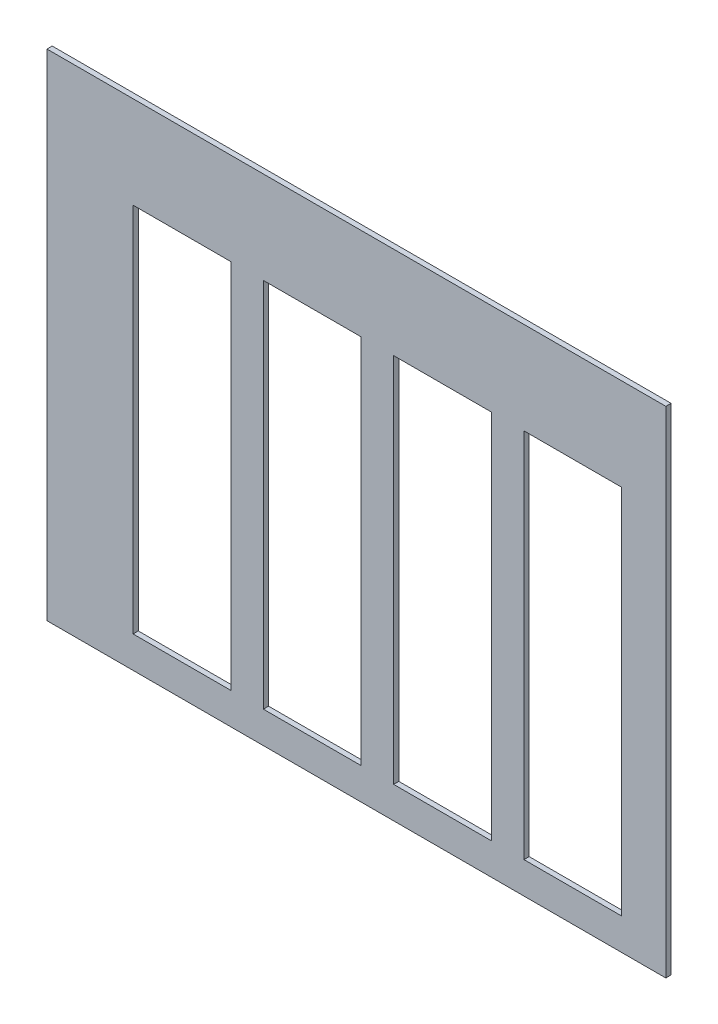
ISO-10303-21;
HEADER;
FILE_DESCRIPTION(('STEP AP214'),'2;1');
FILE_NAME('part.step','',(''),(''),'','','');
FILE_SCHEMA(('AUTOMOTIVE_DESIGN { 1 0 10303 214 1 1 1 1 }'));
ENDSEC;
DATA;
#1=APPLICATION_CONTEXT('core data for automotive mechanical design processes');
#2=APPLICATION_PROTOCOL_DEFINITION('international standard','automotive_design',2000,#1);
#3=PRODUCT_CONTEXT('',#1,'mechanical');
#4=PRODUCT('Part','Part','',(#3));
#5=PRODUCT_RELATED_PRODUCT_CATEGORY('part','',(#4));
#6=PRODUCT_DEFINITION_FORMATION('','',#4);
#7=PRODUCT_DEFINITION_CONTEXT('part definition',#1,'design');
#8=PRODUCT_DEFINITION('design','',#6,#7);
#9=PRODUCT_DEFINITION_SHAPE('','',#8);
#10=(LENGTH_UNIT() NAMED_UNIT(*) SI_UNIT(.MILLI.,.METRE.));
#11=(NAMED_UNIT(*) PLANE_ANGLE_UNIT() SI_UNIT($,.RADIAN.));
#12=(NAMED_UNIT(*) SI_UNIT($,.STERADIAN.) SOLID_ANGLE_UNIT());
#13=UNCERTAINTY_MEASURE_WITH_UNIT(LENGTH_MEASURE(1.E-05),#10,'distance_accuracy_value','');
#14=(GEOMETRIC_REPRESENTATION_CONTEXT(3) GLOBAL_UNCERTAINTY_ASSIGNED_CONTEXT((#13)) GLOBAL_UNIT_ASSIGNED_CONTEXT((#10,
#11,#12)) REPRESENTATION_CONTEXT('',''));
#15=CARTESIAN_POINT('',(0.,0.,0.));
#16=DIRECTION('',(0.,0.,1.));
#17=DIRECTION('',(1.,0.,0.));
#18=AXIS2_PLACEMENT_3D('',#15,#16,#17);
#19=CARTESIAN_POINT('',(0.,0.,8.));
#20=DIRECTION('',(0.,0.,1.));
#21=DIRECTION('',(1.,0.,0.));
#22=AXIS2_PLACEMENT_3D('',#19,#20,#21);
#23=PLANE('',#22);
#24=DIRECTION('',(0.,-1.,0.));
#25=VECTOR('',#24,1.);
#26=CARTESIAN_POINT('',(-725.,218.222891566265,8.));
#27=LINE('',#26,#25);
#28=CARTESIAN_POINT('',(-725.,218.222891566265,8.));
#29=VERTEX_POINT('',#28);
#30=CARTESIAN_POINT('',(-725.,-541.777108433735,8.));
#31=VERTEX_POINT('',#30);
#32=EDGE_CURVE('E307',#29,#31,#27,.T.);
#33=ORIENTED_EDGE('',*,*,#32,.T.);
#34=DIRECTION('',(1.,0.,0.));
#35=VECTOR('',#34,1.);
#36=CARTESIAN_POINT('',(-725.,-541.777108433735,8.));
#37=LINE('',#36,#35);
#38=CARTESIAN_POINT('',(225.,-541.777108433735,8.));
#39=VERTEX_POINT('',#38);
#40=EDGE_CURVE('E310',#31,#39,#37,.T.);
#41=ORIENTED_EDGE('',*,*,#40,.T.);
#42=DIRECTION('',(0.,1.,0.));
#43=VECTOR('',#42,1.);
#44=CARTESIAN_POINT('',(225.,218.222891566265,8.));
#45=LINE('',#44,#43);
#46=CARTESIAN_POINT('',(225.,218.222891566265,8.));
#47=VERTEX_POINT('',#46);
#48=EDGE_CURVE('E313',#39,#47,#45,.T.);
#49=ORIENTED_EDGE('',*,*,#48,.T.);
#50=DIRECTION('',(-1.,0.,0.));
#51=VECTOR('',#50,1.);
#52=CARTESIAN_POINT('',(-725.,218.222891566265,8.));
#53=LINE('',#52,#51);
#54=EDGE_CURVE('E315',#47,#29,#53,.T.);
#55=ORIENTED_EDGE('',*,*,#54,.T.);
#56=EDGE_LOOP('',(#33,#41,#49,#55));
#57=FACE_BOUND('',#56,.T.);
#58=DIRECTION('',(1.,0.,0.));
#59=VECTOR('',#58,1.);
#60=CARTESIAN_POINT('',(-592.817445786005,-493.283894145643,8.));
#61=LINE('',#60,#59);
#62=CARTESIAN_POINT('',(-592.817445786005,-493.283894145643,8.));
#63=VERTEX_POINT('',#62);
#64=CARTESIAN_POINT('',(-442.817445786005,-493.283894145643,8.));
#65=VERTEX_POINT('',#64);
#66=EDGE_CURVE('E278',#63,#65,#61,.T.);
#67=ORIENTED_EDGE('',*,*,#66,.F.);
#68=DIRECTION('',(0.,-1.,0.));
#69=VECTOR('',#68,1.);
#70=CARTESIAN_POINT('',(-592.817445786005,76.7161058543569,8.));
#71=LINE('',#70,#69);
#72=CARTESIAN_POINT('',(-592.817445786005,76.7161058543569,8.));
#73=VERTEX_POINT('',#72);
#74=EDGE_CURVE('E276',#73,#63,#71,.T.);
#75=ORIENTED_EDGE('',*,*,#74,.F.);
#76=DIRECTION('',(-1.,0.,0.));
#77=VECTOR('',#76,1.);
#78=CARTESIAN_POINT('',(-592.817445786005,76.7161058543569,8.));
#79=LINE('',#78,#77);
#80=CARTESIAN_POINT('',(-442.817445786005,76.7161058543569,8.));
#81=VERTEX_POINT('',#80);
#82=EDGE_CURVE('E284',#81,#73,#79,.T.);
#83=ORIENTED_EDGE('',*,*,#82,.F.);
#84=DIRECTION('',(0.,1.,0.));
#85=VECTOR('',#84,1.);
#86=CARTESIAN_POINT('',(-442.817445786005,76.7161058543569,8.));
#87=LINE('',#86,#85);
#88=EDGE_CURVE('E281',#65,#81,#87,.T.);
#89=ORIENTED_EDGE('',*,*,#88,.F.);
#90=EDGE_LOOP('',(#67,#75,#83,#89));
#91=FACE_BOUND('',#90,.T.);
#92=DIRECTION('',(0.,-1.,0.));
#93=VECTOR('',#92,1.);
#94=CARTESIAN_POINT('',(-392.817445786005,76.7161058543569,8.));
#95=LINE('',#94,#93);
#96=CARTESIAN_POINT('',(-392.817445786005,76.7161058543569,8.));
#97=VERTEX_POINT('',#96);
#98=CARTESIAN_POINT('',(-392.817445786005,-493.283894145643,8.));
#99=VERTEX_POINT('',#98);
#100=EDGE_CURVE('E247',#97,#99,#95,.T.);
#101=ORIENTED_EDGE('',*,*,#100,.F.);
#102=DIRECTION('',(-1.,0.,0.));
#103=VECTOR('',#102,1.);
#104=CARTESIAN_POINT('',(-392.817445786005,76.7161058543569,8.));
#105=LINE('',#104,#103);
#106=CARTESIAN_POINT('',(-242.817445786005,76.7161058543569,8.));
#107=VERTEX_POINT('',#106);
#108=EDGE_CURVE('E245',#107,#97,#105,.T.);
#109=ORIENTED_EDGE('',*,*,#108,.F.);
#110=DIRECTION('',(0.,1.,0.));
#111=VECTOR('',#110,1.);
#112=CARTESIAN_POINT('',(-242.817445786005,76.7161058543569,8.));
#113=LINE('',#112,#111);
#114=CARTESIAN_POINT('',(-242.817445786005,-493.283894145643,8.));
#115=VERTEX_POINT('',#114);
#116=EDGE_CURVE('E253',#115,#107,#113,.T.);
#117=ORIENTED_EDGE('',*,*,#116,.F.);
#118=DIRECTION('',(1.,0.,0.));
#119=VECTOR('',#118,1.);
#120=CARTESIAN_POINT('',(-392.817445786005,-493.283894145643,8.));
#121=LINE('',#120,#119);
#122=EDGE_CURVE('E250',#99,#115,#121,.T.);
#123=ORIENTED_EDGE('',*,*,#122,.F.);
#124=EDGE_LOOP('',(#101,#109,#117,#123));
#125=FACE_BOUND('',#124,.T.);
#126=DIRECTION('',(0.,-1.,0.));
#127=VECTOR('',#126,1.);
#128=CARTESIAN_POINT('',(-192.817445786005,76.7161058543569,8.));
#129=LINE('',#128,#127);
#130=CARTESIAN_POINT('',(-192.817445786005,76.7161058543569,8.));
#131=VERTEX_POINT('',#130);
#132=CARTESIAN_POINT('',(-192.817445786005,-493.283894145643,8.));
#133=VERTEX_POINT('',#132);
#134=EDGE_CURVE('E216',#131,#133,#129,.T.);
#135=ORIENTED_EDGE('',*,*,#134,.F.);
#136=DIRECTION('',(-1.,0.,0.));
#137=VECTOR('',#136,1.);
#138=CARTESIAN_POINT('',(-192.817445786005,76.7161058543569,8.));
#139=LINE('',#138,#137);
#140=CARTESIAN_POINT('',(-42.8174457860048,76.7161058543569,8.));
#141=VERTEX_POINT('',#140);
#142=EDGE_CURVE('E214',#141,#131,#139,.T.);
#143=ORIENTED_EDGE('',*,*,#142,.F.);
#144=DIRECTION('',(0.,1.,0.));
#145=VECTOR('',#144,1.);
#146=CARTESIAN_POINT('',(-42.8174457860048,76.7161058543569,8.));
#147=LINE('',#146,#145);
#148=CARTESIAN_POINT('',(-42.8174457860047,-493.283894145643,8.));
#149=VERTEX_POINT('',#148);
#150=EDGE_CURVE('E222',#149,#141,#147,.T.);
#151=ORIENTED_EDGE('',*,*,#150,.F.);
#152=DIRECTION('',(1.,0.,0.));
#153=VECTOR('',#152,1.);
#154=CARTESIAN_POINT('',(-192.817445786005,-493.283894145643,8.));
#155=LINE('',#154,#153);
#156=EDGE_CURVE('E219',#133,#149,#155,.T.);
#157=ORIENTED_EDGE('',*,*,#156,.F.);
#158=EDGE_LOOP('',(#135,#143,#151,#157));
#159=FACE_BOUND('',#158,.T.);
#160=DIRECTION('',(0.,-1.,0.));
#161=VECTOR('',#160,1.);
#162=CARTESIAN_POINT('',(7.18255421399527,76.7161058543569,8.));
#163=LINE('',#162,#161);
#164=CARTESIAN_POINT('',(7.18255421399527,76.7161058543569,8.));
#165=VERTEX_POINT('',#164);
#166=CARTESIAN_POINT('',(7.18255421399538,-493.283894145643,8.));
#167=VERTEX_POINT('',#166);
#168=EDGE_CURVE('E186',#165,#167,#163,.T.);
#169=ORIENTED_EDGE('',*,*,#168,.F.);
#170=DIRECTION('',(-1.,0.,0.));
#171=VECTOR('',#170,1.);
#172=CARTESIAN_POINT('',(7.18255421399527,76.7161058543569,8.));
#173=LINE('',#172,#171);
#174=CARTESIAN_POINT('',(157.182554213995,76.7161058543569,8.));
#175=VERTEX_POINT('',#174);
#176=EDGE_CURVE('E178',#175,#165,#173,.T.);
#177=ORIENTED_EDGE('',*,*,#176,.F.);
#178=DIRECTION('',(0.,1.,0.));
#179=VECTOR('',#178,1.);
#180=CARTESIAN_POINT('',(157.182554213995,76.7161058543569,8.));
#181=LINE('',#180,#179);
#182=CARTESIAN_POINT('',(157.182554213995,-493.283894145643,8.));
#183=VERTEX_POINT('',#182);
#184=EDGE_CURVE('E200',#183,#175,#181,.T.);
#185=ORIENTED_EDGE('',*,*,#184,.F.);
#186=DIRECTION('',(1.,0.,0.));
#187=VECTOR('',#186,1.);
#188=CARTESIAN_POINT('',(7.18255421399538,-493.283894145643,8.));
#189=LINE('',#188,#187);
#190=EDGE_CURVE('E198',#167,#183,#189,.T.);
#191=ORIENTED_EDGE('',*,*,#190,.F.);
#192=EDGE_LOOP('',(#169,#177,#185,#191));
#193=FACE_BOUND('',#192,.T.);
#194=ADVANCED_FACE('F41',(#57,#91,#125,#159,#193),#23,.T.);
#195=CARTESIAN_POINT('',(0.,0.,0.));
#196=DIRECTION('',(0.,0.,1.));
#197=DIRECTION('',(1.,0.,0.));
#198=AXIS2_PLACEMENT_3D('',#195,#196,#197);
#199=PLANE('',#198);
#200=DIRECTION('',(-1.,0.,0.));
#201=VECTOR('',#200,1.);
#202=CARTESIAN_POINT('',(-192.817445786005,76.7161058543569,0.));
#203=LINE('',#202,#201);
#204=CARTESIAN_POINT('',(-42.8174457860048,76.7161058543569,0.));
#205=VERTEX_POINT('',#204);
#206=CARTESIAN_POINT('',(-192.817445786005,76.7161058543569,0.));
#207=VERTEX_POINT('',#206);
#208=EDGE_CURVE('E194',#205,#207,#203,.T.);
#209=ORIENTED_EDGE('',*,*,#208,.T.);
#210=DIRECTION('',(0.,-1.,0.));
#211=VECTOR('',#210,1.);
#212=CARTESIAN_POINT('',(-192.817445786005,76.7161058543569,0.));
#213=LINE('',#212,#211);
#214=CARTESIAN_POINT('',(-192.817445786005,-493.283894145643,0.));
#215=VERTEX_POINT('',#214);
#216=EDGE_CURVE('E227',#207,#215,#213,.T.);
#217=ORIENTED_EDGE('',*,*,#216,.T.);
#218=DIRECTION('',(1.,0.,0.));
#219=VECTOR('',#218,1.);
#220=CARTESIAN_POINT('',(-192.817445786005,-493.283894145643,0.));
#221=LINE('',#220,#219);
#222=CARTESIAN_POINT('',(-42.8174457860047,-493.283894145643,0.));
#223=VERTEX_POINT('',#222);
#224=EDGE_CURVE('E230',#215,#223,#221,.T.);
#225=ORIENTED_EDGE('',*,*,#224,.T.);
#226=DIRECTION('',(0.,1.,0.));
#227=VECTOR('',#226,1.);
#228=CARTESIAN_POINT('',(-42.8174457860048,76.7161058543569,0.));
#229=LINE('',#228,#227);
#230=EDGE_CURVE('E217',#223,#205,#229,.T.);
#231=ORIENTED_EDGE('',*,*,#230,.T.);
#232=EDGE_LOOP('',(#209,#217,#225,#231));
#233=FACE_BOUND('',#232,.T.);
#234=DIRECTION('',(0.,-1.,0.));
#235=VECTOR('',#234,1.);
#236=CARTESIAN_POINT('',(-592.817445786005,76.7161058543569,0.));
#237=LINE('',#236,#235);
#238=CARTESIAN_POINT('',(-592.817445786005,76.7161058543569,0.));
#239=VERTEX_POINT('',#238);
#240=CARTESIAN_POINT('',(-592.817445786005,-493.283894145643,0.));
#241=VERTEX_POINT('',#240);
#242=EDGE_CURVE('E275',#239,#241,#237,.T.);
#243=ORIENTED_EDGE('',*,*,#242,.T.);
#244=DIRECTION('',(1.,0.,0.));
#245=VECTOR('',#244,1.);
#246=CARTESIAN_POINT('',(-592.817445786005,-493.283894145643,0.));
#247=LINE('',#246,#245);
#248=CARTESIAN_POINT('',(-442.817445786005,-493.283894145643,0.));
#249=VERTEX_POINT('',#248);
#250=EDGE_CURVE('E289',#241,#249,#247,.T.);
#251=ORIENTED_EDGE('',*,*,#250,.T.);
#252=DIRECTION('',(0.,1.,0.));
#253=VECTOR('',#252,1.);
#254=CARTESIAN_POINT('',(-442.817445786005,76.7161058543569,0.));
#255=LINE('',#254,#253);
#256=CARTESIAN_POINT('',(-442.817445786005,76.7161058543569,0.));
#257=VERTEX_POINT('',#256);
#258=EDGE_CURVE('E292',#249,#257,#255,.T.);
#259=ORIENTED_EDGE('',*,*,#258,.T.);
#260=DIRECTION('',(-1.,0.,0.));
#261=VECTOR('',#260,1.);
#262=CARTESIAN_POINT('',(-592.817445786005,76.7161058543569,0.));
#263=LINE('',#262,#261);
#264=EDGE_CURVE('E279',#257,#239,#263,.T.);
#265=ORIENTED_EDGE('',*,*,#264,.T.);
#266=EDGE_LOOP('',(#243,#251,#259,#265));
#267=FACE_BOUND('',#266,.T.);
#268=DIRECTION('',(0.,-1.,0.));
#269=VECTOR('',#268,1.);
#270=CARTESIAN_POINT('',(-725.,218.222891566265,0.));
#271=LINE('',#270,#269);
#272=CARTESIAN_POINT('',(-725.,218.222891566265,0.));
#273=VERTEX_POINT('',#272);
#274=CARTESIAN_POINT('',(-725.,-541.777108433735,0.));
#275=VERTEX_POINT('',#274);
#276=EDGE_CURVE('E306',#273,#275,#271,.T.);
#277=ORIENTED_EDGE('',*,*,#276,.F.);
#278=DIRECTION('',(-1.,0.,0.));
#279=VECTOR('',#278,1.);
#280=CARTESIAN_POINT('',(-725.,218.222891566265,0.));
#281=LINE('',#280,#279);
#282=CARTESIAN_POINT('',(225.,218.222891566265,0.));
#283=VERTEX_POINT('',#282);
#284=EDGE_CURVE('E311',#283,#273,#281,.T.);
#285=ORIENTED_EDGE('',*,*,#284,.F.);
#286=DIRECTION('',(0.,1.,0.));
#287=VECTOR('',#286,1.);
#288=CARTESIAN_POINT('',(225.,218.222891566265,0.));
#289=LINE('',#288,#287);
#290=CARTESIAN_POINT('',(225.,-541.777108433735,0.));
#291=VERTEX_POINT('',#290);
#292=EDGE_CURVE('E322',#291,#283,#289,.T.);
#293=ORIENTED_EDGE('',*,*,#292,.F.);
#294=DIRECTION('',(1.,0.,0.));
#295=VECTOR('',#294,1.);
#296=CARTESIAN_POINT('',(-725.,-541.777108433735,0.));
#297=LINE('',#296,#295);
#298=EDGE_CURVE('E320',#275,#291,#297,.T.);
#299=ORIENTED_EDGE('',*,*,#298,.F.);
#300=EDGE_LOOP('',(#277,#285,#293,#299));
#301=FACE_BOUND('',#300,.T.);
#302=DIRECTION('',(-1.,0.,0.));
#303=VECTOR('',#302,1.);
#304=CARTESIAN_POINT('',(-392.817445786005,76.7161058543569,0.));
#305=LINE('',#304,#303);
#306=CARTESIAN_POINT('',(-242.817445786005,76.7161058543569,0.));
#307=VERTEX_POINT('',#306);
#308=CARTESIAN_POINT('',(-392.817445786005,76.7161058543569,0.));
#309=VERTEX_POINT('',#308);
#310=EDGE_CURVE('E244',#307,#309,#305,.T.);
#311=ORIENTED_EDGE('',*,*,#310,.T.);
#312=DIRECTION('',(0.,-1.,0.));
#313=VECTOR('',#312,1.);
#314=CARTESIAN_POINT('',(-392.817445786005,76.7161058543569,0.));
#315=LINE('',#314,#313);
#316=CARTESIAN_POINT('',(-392.817445786005,-493.283894145643,0.));
#317=VERTEX_POINT('',#316);
#318=EDGE_CURVE('E258',#309,#317,#315,.T.);
#319=ORIENTED_EDGE('',*,*,#318,.T.);
#320=DIRECTION('',(1.,0.,0.));
#321=VECTOR('',#320,1.);
#322=CARTESIAN_POINT('',(-392.817445786005,-493.283894145643,0.));
#323=LINE('',#322,#321);
#324=CARTESIAN_POINT('',(-242.817445786005,-493.283894145643,0.));
#325=VERTEX_POINT('',#324);
#326=EDGE_CURVE('E261',#317,#325,#323,.T.);
#327=ORIENTED_EDGE('',*,*,#326,.T.);
#328=DIRECTION('',(0.,1.,0.));
#329=VECTOR('',#328,1.);
#330=CARTESIAN_POINT('',(-242.817445786005,76.7161058543569,0.));
#331=LINE('',#330,#329);
#332=EDGE_CURVE('E248',#325,#307,#331,.T.);
#333=ORIENTED_EDGE('',*,*,#332,.T.);
#334=EDGE_LOOP('',(#311,#319,#327,#333));
#335=FACE_BOUND('',#334,.T.);
#336=DIRECTION('',(-1.,0.,0.));
#337=VECTOR('',#336,1.);
#338=CARTESIAN_POINT('',(7.18255421399527,76.7161058543569,0.));
#339=LINE('',#338,#337);
#340=CARTESIAN_POINT('',(157.182554213995,76.7161058543569,0.));
#341=VERTEX_POINT('',#340);
#342=CARTESIAN_POINT('',(7.18255421399527,76.7161058543569,0.));
#343=VERTEX_POINT('',#342);
#344=EDGE_CURVE('E64',#341,#343,#339,.T.);
#345=ORIENTED_EDGE('',*,*,#344,.T.);
#346=DIRECTION('',(0.,-1.,0.));
#347=VECTOR('',#346,1.);
#348=CARTESIAN_POINT('',(7.18255421399527,76.7161058543569,0.));
#349=LINE('',#348,#347);
#350=CARTESIAN_POINT('',(7.18255421399538,-493.283894145643,0.));
#351=VERTEX_POINT('',#350);
#352=EDGE_CURVE('E193',#343,#351,#349,.T.);
#353=ORIENTED_EDGE('',*,*,#352,.T.);
#354=DIRECTION('',(1.,0.,0.));
#355=VECTOR('',#354,1.);
#356=CARTESIAN_POINT('',(7.18255421399538,-493.283894145643,0.));
#357=LINE('',#356,#355);
#358=CARTESIAN_POINT('',(157.182554213995,-493.283894145643,0.));
#359=VERTEX_POINT('',#358);
#360=EDGE_CURVE('E206',#351,#359,#357,.T.);
#361=ORIENTED_EDGE('',*,*,#360,.T.);
#362=DIRECTION('',(0.,1.,0.));
#363=VECTOR('',#362,1.);
#364=CARTESIAN_POINT('',(157.182554213995,76.7161058543569,0.));
#365=LINE('',#364,#363);
#366=EDGE_CURVE('E187',#359,#341,#365,.T.);
#367=ORIENTED_EDGE('',*,*,#366,.T.);
#368=EDGE_LOOP('',(#345,#353,#361,#367));
#369=FACE_BOUND('',#368,.T.);
#370=ADVANCED_FACE('F340',(#233,#267,#301,#335,#369),#199,.F.);
#371=CARTESIAN_POINT('',(-725.,218.222891566265,8.));
#372=DIRECTION('',(1.,0.,0.));
#373=DIRECTION('',(0.,1.,0.));
#374=AXIS2_PLACEMENT_3D('',#371,#372,#373);
#375=PLANE('',#374);
#376=ORIENTED_EDGE('',*,*,#276,.T.);
#377=DIRECTION('',(0.,0.,-1.));
#378=VECTOR('',#377,1.);
#379=CARTESIAN_POINT('',(-725.,-541.777108433735,8.));
#380=LINE('',#379,#378);
#381=EDGE_CURVE('E11',#31,#275,#380,.T.);
#382=ORIENTED_EDGE('',*,*,#381,.F.);
#383=ORIENTED_EDGE('',*,*,#32,.F.);
#384=DIRECTION('',(0.,0.,-1.));
#385=VECTOR('',#384,1.);
#386=CARTESIAN_POINT('',(-725.,218.222891566265,8.));
#387=LINE('',#386,#385);
#388=EDGE_CURVE('E317',#29,#273,#387,.T.);
#389=ORIENTED_EDGE('',*,*,#388,.T.);
#390=EDGE_LOOP('',(#376,#382,#383,#389));
#391=FACE_BOUND('',#390,.T.);
#392=ADVANCED_FACE('F43',(#391),#375,.F.);
#393=CARTESIAN_POINT('',(-725.,-541.777108433735,8.));
#394=DIRECTION('',(0.,1.,0.));
#395=DIRECTION('',(0.,0.,1.));
#396=AXIS2_PLACEMENT_3D('',#393,#394,#395);
#397=PLANE('',#396);
#398=ORIENTED_EDGE('',*,*,#298,.T.);
#399=DIRECTION('',(0.,0.,-1.));
#400=VECTOR('',#399,1.);
#401=CARTESIAN_POINT('',(225.,-541.777108433735,8.));
#402=LINE('',#401,#400);
#403=EDGE_CURVE('E49',#39,#291,#402,.T.);
#404=ORIENTED_EDGE('',*,*,#403,.F.);
#405=ORIENTED_EDGE('',*,*,#40,.F.);
#406=ORIENTED_EDGE('',*,*,#381,.T.);
#407=EDGE_LOOP('',(#398,#404,#405,#406));
#408=FACE_BOUND('',#407,.T.);
#409=ADVANCED_FACE('F351',(#408),#397,.F.);
#410=CARTESIAN_POINT('',(225.,218.222891566265,8.));
#411=DIRECTION('',(-1.,0.,0.));
#412=DIRECTION('',(0.,-1.,0.));
#413=AXIS2_PLACEMENT_3D('',#410,#411,#412);
#414=PLANE('',#413);
#415=ORIENTED_EDGE('',*,*,#292,.T.);
#416=DIRECTION('',(0.,0.,-1.));
#417=VECTOR('',#416,1.);
#418=CARTESIAN_POINT('',(225.,218.222891566265,8.));
#419=LINE('',#418,#417);
#420=EDGE_CURVE('E327',#47,#283,#419,.T.);
#421=ORIENTED_EDGE('',*,*,#420,.F.);
#422=ORIENTED_EDGE('',*,*,#48,.F.);
#423=ORIENTED_EDGE('',*,*,#403,.T.);
#424=EDGE_LOOP('',(#415,#421,#422,#423));
#425=FACE_BOUND('',#424,.T.);
#426=ADVANCED_FACE('F334',(#425),#414,.F.);
#427=CARTESIAN_POINT('',(-725.,218.222891566265,8.));
#428=DIRECTION('',(0.,-1.,0.));
#429=DIRECTION('',(1.,0.,0.));
#430=AXIS2_PLACEMENT_3D('',#427,#428,#429);
#431=PLANE('',#430);
#432=ORIENTED_EDGE('',*,*,#284,.T.);
#433=ORIENTED_EDGE('',*,*,#388,.F.);
#434=ORIENTED_EDGE('',*,*,#54,.F.);
#435=ORIENTED_EDGE('',*,*,#420,.T.);
#436=EDGE_LOOP('',(#432,#433,#434,#435));
#437=FACE_BOUND('',#436,.T.);
#438=ADVANCED_FACE('F344',(#437),#431,.F.);
#439=CARTESIAN_POINT('',(-592.817445786005,76.7161058543569,8.));
#440=DIRECTION('',(1.,0.,0.));
#441=DIRECTION('',(0.,1.,0.));
#442=AXIS2_PLACEMENT_3D('',#439,#440,#441);
#443=PLANE('',#442);
#444=ORIENTED_EDGE('',*,*,#242,.F.);
#445=DIRECTION('',(0.,0.,-1.));
#446=VECTOR('',#445,1.);
#447=CARTESIAN_POINT('',(-592.817445786005,76.7161058543569,8.));
#448=LINE('',#447,#446);
#449=EDGE_CURVE('E286',#73,#239,#448,.T.);
#450=ORIENTED_EDGE('',*,*,#449,.F.);
#451=ORIENTED_EDGE('',*,*,#74,.T.);
#452=DIRECTION('',(0.,0.,-1.));
#453=VECTOR('',#452,1.);
#454=CARTESIAN_POINT('',(-592.817445786005,-493.283894145643,8.));
#455=LINE('',#454,#453);
#456=EDGE_CURVE('E303',#63,#241,#455,.T.);
#457=ORIENTED_EDGE('',*,*,#456,.T.);
#458=EDGE_LOOP('',(#444,#450,#451,#457));
#459=FACE_BOUND('',#458,.T.);
#460=ADVANCED_FACE('F366',(#459),#443,.T.);
#461=CARTESIAN_POINT('',(-592.817445786005,-493.283894145643,8.));
#462=DIRECTION('',(0.,1.,0.));
#463=DIRECTION('',(0.,0.,1.));
#464=AXIS2_PLACEMENT_3D('',#461,#462,#463);
#465=PLANE('',#464);
#466=ORIENTED_EDGE('',*,*,#250,.F.);
#467=ORIENTED_EDGE('',*,*,#456,.F.);
#468=ORIENTED_EDGE('',*,*,#66,.T.);
#469=DIRECTION('',(0.,0.,-1.));
#470=VECTOR('',#469,1.);
#471=CARTESIAN_POINT('',(-442.817445786005,-493.283894145643,8.));
#472=LINE('',#471,#470);
#473=EDGE_CURVE('E301',#65,#249,#472,.T.);
#474=ORIENTED_EDGE('',*,*,#473,.T.);
#475=EDGE_LOOP('',(#466,#467,#468,#474));
#476=FACE_BOUND('',#475,.T.);
#477=ADVANCED_FACE('F373',(#476),#465,.T.);
#478=CARTESIAN_POINT('',(-442.817445786005,76.7161058543569,8.));
#479=DIRECTION('',(-1.,0.,0.));
#480=DIRECTION('',(0.,-1.,0.));
#481=AXIS2_PLACEMENT_3D('',#478,#479,#480);
#482=PLANE('',#481);
#483=ORIENTED_EDGE('',*,*,#258,.F.);
#484=ORIENTED_EDGE('',*,*,#473,.F.);
#485=ORIENTED_EDGE('',*,*,#88,.T.);
#486=DIRECTION('',(0.,0.,-1.));
#487=VECTOR('',#486,1.);
#488=CARTESIAN_POINT('',(-442.817445786005,76.7161058543569,8.));
#489=LINE('',#488,#487);
#490=EDGE_CURVE('E299',#81,#257,#489,.T.);
#491=ORIENTED_EDGE('',*,*,#490,.T.);
#492=EDGE_LOOP('',(#483,#484,#485,#491));
#493=FACE_BOUND('',#492,.T.);
#494=ADVANCED_FACE('F378',(#493),#482,.T.);
#495=CARTESIAN_POINT('',(-592.817445786005,76.7161058543569,8.));
#496=DIRECTION('',(0.,-1.,0.));
#497=DIRECTION('',(0.,0.,-1.));
#498=AXIS2_PLACEMENT_3D('',#495,#496,#497);
#499=PLANE('',#498);
#500=ORIENTED_EDGE('',*,*,#264,.F.);
#501=ORIENTED_EDGE('',*,*,#490,.F.);
#502=ORIENTED_EDGE('',*,*,#82,.T.);
#503=ORIENTED_EDGE('',*,*,#449,.T.);
#504=EDGE_LOOP('',(#500,#501,#502,#503));
#505=FACE_BOUND('',#504,.T.);
#506=ADVANCED_FACE('F386',(#505),#499,.T.);
#507=CARTESIAN_POINT('',(-392.817445786005,76.7161058543569,8.));
#508=DIRECTION('',(0.,-1.,0.));
#509=DIRECTION('',(0.,0.,-1.));
#510=AXIS2_PLACEMENT_3D('',#507,#508,#509);
#511=PLANE('',#510);
#512=ORIENTED_EDGE('',*,*,#310,.F.);
#513=DIRECTION('',(0.,0.,-1.));
#514=VECTOR('',#513,1.);
#515=CARTESIAN_POINT('',(-242.817445786005,76.7161058543569,8.));
#516=LINE('',#515,#514);
#517=EDGE_CURVE('E255',#107,#307,#516,.T.);
#518=ORIENTED_EDGE('',*,*,#517,.F.);
#519=ORIENTED_EDGE('',*,*,#108,.T.);
#520=DIRECTION('',(0.,0.,-1.));
#521=VECTOR('',#520,1.);
#522=CARTESIAN_POINT('',(-392.817445786005,76.7161058543569,8.));
#523=LINE('',#522,#521);
#524=EDGE_CURVE('E272',#97,#309,#523,.T.);
#525=ORIENTED_EDGE('',*,*,#524,.T.);
#526=EDGE_LOOP('',(#512,#518,#519,#525));
#527=FACE_BOUND('',#526,.T.);
#528=ADVANCED_FACE('F440',(#527),#511,.T.);
#529=CARTESIAN_POINT('',(-392.817445786005,76.7161058543569,8.));
#530=DIRECTION('',(1.,0.,0.));
#531=DIRECTION('',(0.,1.,0.));
#532=AXIS2_PLACEMENT_3D('',#529,#530,#531);
#533=PLANE('',#532);
#534=ORIENTED_EDGE('',*,*,#318,.F.);
#535=ORIENTED_EDGE('',*,*,#524,.F.);
#536=ORIENTED_EDGE('',*,*,#100,.T.);
#537=DIRECTION('',(0.,0.,-1.));
#538=VECTOR('',#537,1.);
#539=CARTESIAN_POINT('',(-392.817445786005,-493.283894145643,8.));
#540=LINE('',#539,#538);
#541=EDGE_CURVE('E270',#99,#317,#540,.T.);
#542=ORIENTED_EDGE('',*,*,#541,.T.);
#543=EDGE_LOOP('',(#534,#535,#536,#542));
#544=FACE_BOUND('',#543,.T.);
#545=ADVANCED_FACE('F436',(#544),#533,.T.);
#546=CARTESIAN_POINT('',(-392.817445786005,-493.283894145643,8.));
#547=DIRECTION('',(0.,1.,0.));
#548=DIRECTION('',(0.,0.,1.));
#549=AXIS2_PLACEMENT_3D('',#546,#547,#548);
#550=PLANE('',#549);
#551=ORIENTED_EDGE('',*,*,#326,.F.);
#552=ORIENTED_EDGE('',*,*,#541,.F.);
#553=ORIENTED_EDGE('',*,*,#122,.T.);
#554=DIRECTION('',(0.,0.,-1.));
#555=VECTOR('',#554,1.);
#556=CARTESIAN_POINT('',(-242.817445786005,-493.283894145643,8.));
#557=LINE('',#556,#555);
#558=EDGE_CURVE('E268',#115,#325,#557,.T.);
#559=ORIENTED_EDGE('',*,*,#558,.T.);
#560=EDGE_LOOP('',(#551,#552,#553,#559));
#561=FACE_BOUND('',#560,.T.);
#562=ADVANCED_FACE('F432',(#561),#550,.T.);
#563=CARTESIAN_POINT('',(-242.817445786005,76.7161058543569,8.));
#564=DIRECTION('',(-1.,0.,0.));
#565=DIRECTION('',(0.,-1.,0.));
#566=AXIS2_PLACEMENT_3D('',#563,#564,#565);
#567=PLANE('',#566);
#568=ORIENTED_EDGE('',*,*,#332,.F.);
#569=ORIENTED_EDGE('',*,*,#558,.F.);
#570=ORIENTED_EDGE('',*,*,#116,.T.);
#571=ORIENTED_EDGE('',*,*,#517,.T.);
#572=EDGE_LOOP('',(#568,#569,#570,#571));
#573=FACE_BOUND('',#572,.T.);
#574=ADVANCED_FACE('F429',(#573),#567,.T.);
#575=CARTESIAN_POINT('',(-192.817445786005,76.7161058543569,8.));
#576=DIRECTION('',(0.,-1.,0.));
#577=DIRECTION('',(0.,0.,-1.));
#578=AXIS2_PLACEMENT_3D('',#575,#576,#577);
#579=PLANE('',#578);
#580=ORIENTED_EDGE('',*,*,#208,.F.);
#581=DIRECTION('',(0.,0.,-1.));
#582=VECTOR('',#581,1.);
#583=CARTESIAN_POINT('',(-42.8174457860048,76.7161058543569,8.));
#584=LINE('',#583,#582);
#585=EDGE_CURVE('E224',#141,#205,#584,.T.);
#586=ORIENTED_EDGE('',*,*,#585,.F.);
#587=ORIENTED_EDGE('',*,*,#142,.T.);
#588=DIRECTION('',(0.,0.,-1.));
#589=VECTOR('',#588,1.);
#590=CARTESIAN_POINT('',(-192.817445786005,76.7161058543569,8.));
#591=LINE('',#590,#589);
#592=EDGE_CURVE('E241',#131,#207,#591,.T.);
#593=ORIENTED_EDGE('',*,*,#592,.T.);
#594=EDGE_LOOP('',(#580,#586,#587,#593));
#595=FACE_BOUND('',#594,.T.);
#596=ADVANCED_FACE('F411',(#595),#579,.T.);
#597=CARTESIAN_POINT('',(-192.817445786005,76.7161058543569,8.));
#598=DIRECTION('',(1.,0.,0.));
#599=DIRECTION('',(0.,1.,0.));
#600=AXIS2_PLACEMENT_3D('',#597,#598,#599);
#601=PLANE('',#600);
#602=ORIENTED_EDGE('',*,*,#216,.F.);
#603=ORIENTED_EDGE('',*,*,#592,.F.);
#604=ORIENTED_EDGE('',*,*,#134,.T.);
#605=DIRECTION('',(0.,0.,-1.));
#606=VECTOR('',#605,1.);
#607=CARTESIAN_POINT('',(-192.817445786005,-493.283894145643,8.));
#608=LINE('',#607,#606);
#609=EDGE_CURVE('E239',#133,#215,#608,.T.);
#610=ORIENTED_EDGE('',*,*,#609,.T.);
#611=EDGE_LOOP('',(#602,#603,#604,#610));
#612=FACE_BOUND('',#611,.T.);
#613=ADVANCED_FACE('F405',(#612),#601,.T.);
#614=CARTESIAN_POINT('',(-192.817445786005,-493.283894145643,8.));
#615=DIRECTION('',(0.,1.,0.));
#616=DIRECTION('',(0.,0.,1.));
#617=AXIS2_PLACEMENT_3D('',#614,#615,#616);
#618=PLANE('',#617);
#619=ORIENTED_EDGE('',*,*,#224,.F.);
#620=ORIENTED_EDGE('',*,*,#609,.F.);
#621=ORIENTED_EDGE('',*,*,#156,.T.);
#622=DIRECTION('',(0.,0.,-1.));
#623=VECTOR('',#622,1.);
#624=CARTESIAN_POINT('',(-42.8174457860047,-493.283894145643,8.));
#625=LINE('',#624,#623);
#626=EDGE_CURVE('E237',#149,#223,#625,.T.);
#627=ORIENTED_EDGE('',*,*,#626,.T.);
#628=EDGE_LOOP('',(#619,#620,#621,#627));
#629=FACE_BOUND('',#628,.T.);
#630=ADVANCED_FACE('F408',(#629),#618,.T.);
#631=CARTESIAN_POINT('',(-42.8174457860048,76.7161058543569,8.));
#632=DIRECTION('',(-1.,0.,0.));
#633=DIRECTION('',(0.,-1.,0.));
#634=AXIS2_PLACEMENT_3D('',#631,#632,#633);
#635=PLANE('',#634);
#636=ORIENTED_EDGE('',*,*,#230,.F.);
#637=ORIENTED_EDGE('',*,*,#626,.F.);
#638=ORIENTED_EDGE('',*,*,#150,.T.);
#639=ORIENTED_EDGE('',*,*,#585,.T.);
#640=EDGE_LOOP('',(#636,#637,#638,#639));
#641=FACE_BOUND('',#640,.T.);
#642=ADVANCED_FACE('F414',(#641),#635,.T.);
#643=CARTESIAN_POINT('',(7.18255421399527,76.7161058543569,8.));
#644=DIRECTION('',(0.,-1.,0.));
#645=DIRECTION('',(0.,0.,-1.));
#646=AXIS2_PLACEMENT_3D('',#643,#644,#645);
#647=PLANE('',#646);
#648=ORIENTED_EDGE('',*,*,#344,.F.);
#649=DIRECTION('',(0.,0.,-1.));
#650=VECTOR('',#649,1.);
#651=CARTESIAN_POINT('',(157.182554213995,76.7161058543569,8.));
#652=LINE('',#651,#650);
#653=EDGE_CURVE('E182',#175,#341,#652,.T.);
#654=ORIENTED_EDGE('',*,*,#653,.F.);
#655=ORIENTED_EDGE('',*,*,#176,.T.);
#656=DIRECTION('',(0.,0.,-1.));
#657=VECTOR('',#656,1.);
#658=CARTESIAN_POINT('',(7.18255421399527,76.7161058543569,8.));
#659=LINE('',#658,#657);
#660=EDGE_CURVE('E181',#165,#343,#659,.T.);
#661=ORIENTED_EDGE('',*,*,#660,.T.);
#662=EDGE_LOOP('',(#648,#654,#655,#661));
#663=FACE_BOUND('',#662,.T.);
#664=ADVANCED_FACE('F180',(#663),#647,.T.);
#665=CARTESIAN_POINT('',(7.18255421399527,76.7161058543569,8.));
#666=DIRECTION('',(1.,0.,0.));
#667=DIRECTION('',(0.,1.,0.));
#668=AXIS2_PLACEMENT_3D('',#665,#666,#667);
#669=PLANE('',#668);
#670=ORIENTED_EDGE('',*,*,#352,.F.);
#671=ORIENTED_EDGE('',*,*,#660,.F.);
#672=ORIENTED_EDGE('',*,*,#168,.T.);
#673=DIRECTION('',(0.,0.,-1.));
#674=VECTOR('',#673,1.);
#675=CARTESIAN_POINT('',(7.18255421399538,-493.283894145643,8.));
#676=LINE('',#675,#674);
#677=EDGE_CURVE('E195',#167,#351,#676,.T.);
#678=ORIENTED_EDGE('',*,*,#677,.T.);
#679=EDGE_LOOP('',(#670,#671,#672,#678));
#680=FACE_BOUND('',#679,.T.);
#681=ADVANCED_FACE('F190',(#680),#669,.T.);
#682=CARTESIAN_POINT('',(7.18255421399538,-493.283894145643,8.));
#683=DIRECTION('',(0.,1.,0.));
#684=DIRECTION('',(0.,0.,1.));
#685=AXIS2_PLACEMENT_3D('',#682,#683,#684);
#686=PLANE('',#685);
#687=ORIENTED_EDGE('',*,*,#360,.F.);
#688=ORIENTED_EDGE('',*,*,#677,.F.);
#689=ORIENTED_EDGE('',*,*,#190,.T.);
#690=DIRECTION('',(0.,0.,-1.));
#691=VECTOR('',#690,1.);
#692=CARTESIAN_POINT('',(157.182554213995,-493.283894145643,8.));
#693=LINE('',#692,#691);
#694=EDGE_CURVE('E56',#183,#359,#693,.T.);
#695=ORIENTED_EDGE('',*,*,#694,.T.);
#696=EDGE_LOOP('',(#687,#688,#689,#695));
#697=FACE_BOUND('',#696,.T.);
#698=ADVANCED_FACE('F506',(#697),#686,.T.);
#699=CARTESIAN_POINT('',(157.182554213995,76.7161058543569,8.));
#700=DIRECTION('',(-1.,0.,0.));
#701=DIRECTION('',(0.,-1.,0.));
#702=AXIS2_PLACEMENT_3D('',#699,#700,#701);
#703=PLANE('',#702);
#704=ORIENTED_EDGE('',*,*,#366,.F.);
#705=ORIENTED_EDGE('',*,*,#694,.F.);
#706=ORIENTED_EDGE('',*,*,#184,.T.);
#707=ORIENTED_EDGE('',*,*,#653,.T.);
#708=EDGE_LOOP('',(#704,#705,#706,#707));
#709=FACE_BOUND('',#708,.T.);
#710=ADVANCED_FACE('F515',(#709),#703,.T.);
#711=CLOSED_SHELL('',(#194,#370,#392,#409,#426,#438,#460,#477,#494,#506,#528,#545,#562,#574,
#596,#613,#630,#642,#664,#681,#698,#710));
#712=MANIFOLD_SOLID_BREP('B2',#711);
#713=ADVANCED_BREP_SHAPE_REPRESENTATION('',(#18,#712),#14);
#714=SHAPE_DEFINITION_REPRESENTATION(#9,#713);
ENDSEC;
END-ISO-10303-21;
